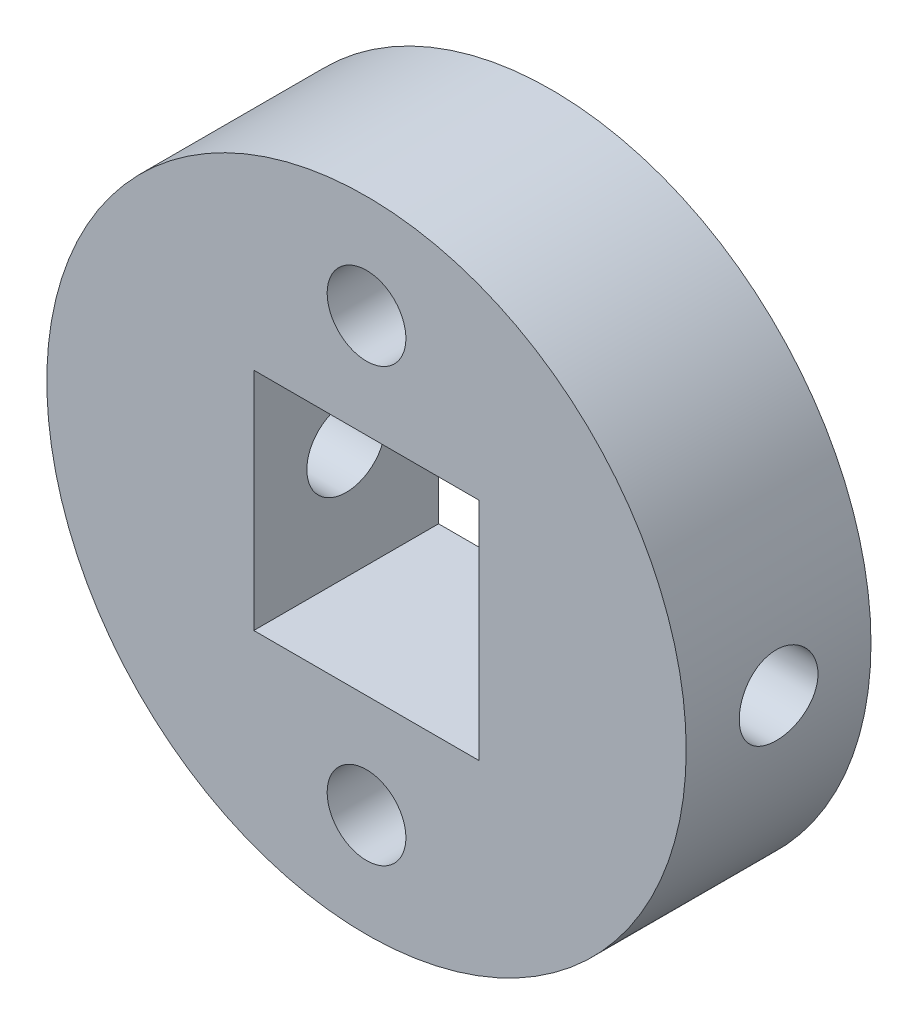
ISO-10303-21;
HEADER;
FILE_DESCRIPTION(('STEP AP214'),'2;1');
FILE_NAME('part.step','',(''),(''),'','','');
FILE_SCHEMA(('AUTOMOTIVE_DESIGN { 1 0 10303 214 1 1 1 1 }'));
ENDSEC;
DATA;
#1=APPLICATION_CONTEXT('core data for automotive mechanical design processes');
#2=APPLICATION_PROTOCOL_DEFINITION('international standard','automotive_design',2000,#1);
#3=PRODUCT_CONTEXT('',#1,'mechanical');
#4=PRODUCT('Part','Part','',(#3));
#5=PRODUCT_RELATED_PRODUCT_CATEGORY('part','',(#4));
#6=PRODUCT_DEFINITION_FORMATION('','',#4);
#7=PRODUCT_DEFINITION_CONTEXT('part definition',#1,'design');
#8=PRODUCT_DEFINITION('design','',#6,#7);
#9=PRODUCT_DEFINITION_SHAPE('','',#8);
#10=(LENGTH_UNIT() NAMED_UNIT(*) SI_UNIT(.MILLI.,.METRE.));
#11=(NAMED_UNIT(*) PLANE_ANGLE_UNIT() SI_UNIT($,.RADIAN.));
#12=(NAMED_UNIT(*) SI_UNIT($,.STERADIAN.) SOLID_ANGLE_UNIT());
#13=UNCERTAINTY_MEASURE_WITH_UNIT(LENGTH_MEASURE(1.E-05),#10,'distance_accuracy_value','');
#14=(GEOMETRIC_REPRESENTATION_CONTEXT(3) GLOBAL_UNCERTAINTY_ASSIGNED_CONTEXT((#13)) GLOBAL_UNIT_ASSIGNED_CONTEXT((#10,
#11,#12)) REPRESENTATION_CONTEXT('',''));
#15=CARTESIAN_POINT('',(0.,0.,0.));
#16=DIRECTION('',(0.,0.,1.));
#17=DIRECTION('',(1.,0.,0.));
#18=AXIS2_PLACEMENT_3D('',#15,#16,#17);
#19=CARTESIAN_POINT('',(0.,0.,6.35));
#20=DIRECTION('',(0.,0.,1.));
#21=DIRECTION('',(1.,0.,0.));
#22=AXIS2_PLACEMENT_3D('',#19,#20,#21);
#23=PLANE('',#22);
#24=CARTESIAN_POINT('',(0.,-7.4295,6.35));
#25=DIRECTION('',(0.,0.,-1.));
#26=DIRECTION('',(-1.,0.,0.));
#27=AXIS2_PLACEMENT_3D('',#24,#25,#26);
#28=CIRCLE('',#27,1.35255);
#29=CARTESIAN_POINT('',(-1.35255,-7.4295,6.35));
#30=VERTEX_POINT('',#29);
#31=EDGE_CURVE('E170',#30,#30,#28,.T.);
#32=ORIENTED_EDGE('',*,*,#31,.T.);
#33=EDGE_LOOP('',(#32));
#34=FACE_BOUND('',#33,.T.);
#35=CARTESIAN_POINT('',(0.,7.4295,6.35));
#36=DIRECTION('',(0.,0.,-1.));
#37=DIRECTION('',(-1.,0.,0.));
#38=AXIS2_PLACEMENT_3D('',#35,#36,#37);
#39=CIRCLE('',#38,1.35255);
#40=CARTESIAN_POINT('',(-1.35255,7.4295,6.35));
#41=VERTEX_POINT('',#40);
#42=EDGE_CURVE('E169',#41,#41,#39,.T.);
#43=ORIENTED_EDGE('',*,*,#42,.T.);
#44=EDGE_LOOP('',(#43));
#45=FACE_BOUND('',#44,.T.);
#46=CARTESIAN_POINT('',(0.,0.,6.35));
#47=DIRECTION('',(0.,0.,1.));
#48=DIRECTION('',(1.,0.,0.));
#49=AXIS2_PLACEMENT_3D('',#46,#47,#48);
#50=CIRCLE('',#49,10.9855);
#51=CARTESIAN_POINT('',(10.9855,0.,6.35));
#52=VERTEX_POINT('',#51);
#53=EDGE_CURVE('E118',#52,#52,#50,.T.);
#54=ORIENTED_EDGE('',*,*,#53,.T.);
#55=EDGE_LOOP('',(#54));
#56=FACE_BOUND('',#55,.T.);
#57=DIRECTION('',(-1.,0.,0.));
#58=VECTOR('',#57,1.);
#59=CARTESIAN_POINT('',(-3.8735,3.8735,6.35));
#60=LINE('',#59,#58);
#61=CARTESIAN_POINT('',(3.8735,3.8735,6.35));
#62=VERTEX_POINT('',#61);
#63=CARTESIAN_POINT('',(-3.8735,3.8735,6.35));
#64=VERTEX_POINT('',#63);
#65=EDGE_CURVE('E88',#62,#64,#60,.T.);
#66=ORIENTED_EDGE('',*,*,#65,.F.);
#67=DIRECTION('',(0.,1.,0.));
#68=VECTOR('',#67,1.);
#69=CARTESIAN_POINT('',(3.8735,-3.8735,6.35));
#70=LINE('',#69,#68);
#71=CARTESIAN_POINT('',(3.8735,-3.8735,6.35));
#72=VERTEX_POINT('',#71);
#73=EDGE_CURVE('E80',#72,#62,#70,.T.);
#74=ORIENTED_EDGE('',*,*,#73,.F.);
#75=DIRECTION('',(1.,0.,0.));
#76=VECTOR('',#75,1.);
#77=CARTESIAN_POINT('',(-3.8735,-3.8735,6.35));
#78=LINE('',#77,#76);
#79=CARTESIAN_POINT('',(-3.8735,-3.8735,6.35));
#80=VERTEX_POINT('',#79);
#81=EDGE_CURVE('E102',#80,#72,#78,.T.);
#82=ORIENTED_EDGE('',*,*,#81,.F.);
#83=DIRECTION('',(0.,-1.,0.));
#84=VECTOR('',#83,1.);
#85=CARTESIAN_POINT('',(-3.8735,-3.8735,6.35));
#86=LINE('',#85,#84);
#87=EDGE_CURVE('E100',#64,#80,#86,.T.);
#88=ORIENTED_EDGE('',*,*,#87,.F.);
#89=EDGE_LOOP('',(#66,#74,#82,#88));
#90=FACE_BOUND('',#89,.T.);
#91=ADVANCED_FACE('F35',(#34,#45,#56,#90),#23,.T.);
#92=CARTESIAN_POINT('',(0.,0.,0.));
#93=DIRECTION('',(0.,0.,1.));
#94=DIRECTION('',(1.,0.,0.));
#95=AXIS2_PLACEMENT_3D('',#92,#93,#94);
#96=PLANE('',#95);
#97=CARTESIAN_POINT('',(0.,-7.4295,0.));
#98=DIRECTION('',(0.,0.,-1.));
#99=DIRECTION('',(-1.,0.,0.));
#100=AXIS2_PLACEMENT_3D('',#97,#98,#99);
#101=CIRCLE('',#100,1.35255);
#102=CARTESIAN_POINT('',(-1.35255,-7.4295,0.));
#103=VERTEX_POINT('',#102);
#104=EDGE_CURVE('E158',#103,#103,#101,.T.);
#105=ORIENTED_EDGE('',*,*,#104,.F.);
#106=EDGE_LOOP('',(#105));
#107=FACE_BOUND('',#106,.T.);
#108=CARTESIAN_POINT('',(0.,7.4295,0.));
#109=DIRECTION('',(0.,0.,-1.));
#110=DIRECTION('',(-1.,0.,0.));
#111=AXIS2_PLACEMENT_3D('',#108,#109,#110);
#112=CIRCLE('',#111,1.35255);
#113=CARTESIAN_POINT('',(-1.35255,7.4295,0.));
#114=VERTEX_POINT('',#113);
#115=EDGE_CURVE('E162',#114,#114,#112,.T.);
#116=ORIENTED_EDGE('',*,*,#115,.F.);
#117=EDGE_LOOP('',(#116));
#118=FACE_BOUND('',#117,.T.);
#119=CARTESIAN_POINT('',(0.,0.,0.));
#120=DIRECTION('',(0.,0.,1.));
#121=DIRECTION('',(1.,0.,0.));
#122=AXIS2_PLACEMENT_3D('',#119,#120,#121);
#123=CIRCLE('',#122,10.9855);
#124=CARTESIAN_POINT('',(10.9855,0.,0.));
#125=VERTEX_POINT('',#124);
#126=EDGE_CURVE('E96',#125,#125,#123,.T.);
#127=ORIENTED_EDGE('',*,*,#126,.F.);
#128=EDGE_LOOP('',(#127));
#129=FACE_BOUND('',#128,.T.);
#130=DIRECTION('',(0.,1.,0.));
#131=VECTOR('',#130,1.);
#132=CARTESIAN_POINT('',(3.8735,-3.8735,0.));
#133=LINE('',#132,#131);
#134=CARTESIAN_POINT('',(3.8735,-3.8735,0.));
#135=VERTEX_POINT('',#134);
#136=CARTESIAN_POINT('',(3.8735,3.8735,0.));
#137=VERTEX_POINT('',#136);
#138=EDGE_CURVE('E62',#135,#137,#133,.T.);
#139=ORIENTED_EDGE('',*,*,#138,.T.);
#140=DIRECTION('',(-1.,0.,0.));
#141=VECTOR('',#140,1.);
#142=CARTESIAN_POINT('',(-3.8735,3.8735,0.));
#143=LINE('',#142,#141);
#144=CARTESIAN_POINT('',(-3.8735,3.8735,0.));
#145=VERTEX_POINT('',#144);
#146=EDGE_CURVE('E95',#137,#145,#143,.T.);
#147=ORIENTED_EDGE('',*,*,#146,.T.);
#148=DIRECTION('',(0.,-1.,0.));
#149=VECTOR('',#148,1.);
#150=CARTESIAN_POINT('',(-3.8735,-3.8735,0.));
#151=LINE('',#150,#149);
#152=CARTESIAN_POINT('',(-3.8735,-3.8735,0.));
#153=VERTEX_POINT('',#152);
#154=EDGE_CURVE('E110',#145,#153,#151,.T.);
#155=ORIENTED_EDGE('',*,*,#154,.T.);
#156=DIRECTION('',(1.,0.,0.));
#157=VECTOR('',#156,1.);
#158=CARTESIAN_POINT('',(-3.8735,-3.8735,0.));
#159=LINE('',#158,#157);
#160=EDGE_CURVE('E89',#153,#135,#159,.T.);
#161=ORIENTED_EDGE('',*,*,#160,.T.);
#162=EDGE_LOOP('',(#139,#147,#155,#161));
#163=FACE_BOUND('',#162,.T.);
#164=ADVANCED_FACE('F147',(#107,#118,#129,#163),#96,.F.);
#165=CARTESIAN_POINT('',(0.,0.,6.35));
#166=DIRECTION('',(0.,0.,-1.));
#167=DIRECTION('',(-1.,0.,0.));
#168=AXIS2_PLACEMENT_3D('',#165,#166,#167);
#169=CYLINDRICAL_SURFACE('',#168,10.9855);
#170=CARTESIAN_POINT('',(-10.9855,0.,1.82245000000001));
#171=CARTESIAN_POINT('',(-10.985498957363,0.0756662162892515,1.82245322021186));
#172=CARTESIAN_POINT('',(-10.984709975864,0.151379942554252,1.82882094142912));
#173=CARTESIAN_POINT('',(-10.9816384618443,0.300701184764233,1.85412287565918));
#174=CARTESIAN_POINT('',(-10.9793543627383,0.374306406888228,1.87307026996058));
#175=CARTESIAN_POINT('',(-10.9735499724927,0.517227243019656,1.92296540642161));
#176=CARTESIAN_POINT('',(-10.9700305065537,0.586545684246488,1.95390513937142));
#177=CARTESIAN_POINT('',(-10.9621469922232,0.71899296324033,2.02688932930371));
#178=CARTESIAN_POINT('',(-10.9577830906441,0.782122874066539,2.06893185643231));
#179=CARTESIAN_POINT('',(-10.9486719690168,0.900752004222969,2.16316864625308));
#180=CARTESIAN_POINT('',(-10.9439230188851,0.956213365972777,2.21541040312885));
#181=CARTESIAN_POINT('',(-10.9345910150808,1.05760506470752,2.32846077026844));
#182=CARTESIAN_POINT('',(-10.9300079698058,1.1035349197966,2.38926981341804));
#183=CARTESIAN_POINT('',(-10.9215096106737,1.18470031478497,2.51797394252124));
#184=CARTESIAN_POINT('',(-10.9175965239231,1.21990047795271,2.58589149801702));
#185=CARTESIAN_POINT('',(-10.9109038561484,1.27838136450854,2.72673014975643));
#186=CARTESIAN_POINT('',(-10.9081242333961,1.30166252669949,2.79965106168735));
#187=CARTESIAN_POINT('',(-10.9040296732988,1.33552971643817,2.94803404313264));
#188=CARTESIAN_POINT('',(-10.9027073727078,1.34617958568991,3.02348133458864));
#189=CARTESIAN_POINT('',(-10.9016546151378,1.35467941015745,3.17510303021034));
#190=CARTESIAN_POINT('',(-10.9019240959895,1.35252986527228,3.25127740586274));
#191=CARTESIAN_POINT('',(-10.904017715658,1.33554430280861,3.40174643573768));
#192=CARTESIAN_POINT('',(-10.905833242709,1.32077855829166,3.47604915951025));
#193=CARTESIAN_POINT('',(-10.9108009572682,1.27908936011294,3.62111402003232));
#194=CARTESIAN_POINT('',(-10.9139531711192,1.25216566684779,3.69187608697361));
#195=CARTESIAN_POINT('',(-10.9212488607713,1.18684913528334,3.82806957290694));
#196=CARTESIAN_POINT('',(-10.9253949745184,1.14842570650951,3.893486174053));
#197=CARTESIAN_POINT('',(-10.9342092467618,1.06122229554948,4.01696943795403));
#198=CARTESIAN_POINT('',(-10.9388774284228,1.01244185372596,4.07503577432654));
#199=CARTESIAN_POINT('',(-10.9482481397586,0.905519407597169,4.18257814431771));
#200=CARTESIAN_POINT('',(-10.9529506898525,0.847316821845073,4.2319939638781));
#201=CARTESIAN_POINT('',(-10.9618309693402,0.723410981534479,4.32036390388339));
#202=CARTESIAN_POINT('',(-10.9660086975844,0.657707710547477,4.35931800141369));
#203=CARTESIAN_POINT('',(-10.973371100294,0.520619528099018,4.4256585752767));
#204=CARTESIAN_POINT('',(-10.9765554560804,0.449232802556392,4.45304134046406));
#205=CARTESIAN_POINT('',(-10.9815694072985,0.302826693394582,4.49541445569743));
#206=CARTESIAN_POINT('',(-10.9833990642513,0.227807474903285,4.51040536850035));
#207=CARTESIAN_POINT('',(-10.9854894761024,0.076786607145977,4.52749133655337));
#208=CARTESIAN_POINT('',(-10.9857603235799,0.000794477815036689,4.52966935150521));
#209=CARTESIAN_POINT('',(-10.98472983342,-0.150471667753615,4.52128654388073));
#210=CARTESIAN_POINT('',(-10.983428528243,-0.225745698785651,4.51072598431938));
#211=CARTESIAN_POINT('',(-10.9794062526405,-0.37319454870657,4.47723471389979));
#212=CARTESIAN_POINT('',(-10.9766898160552,-0.445378473165177,4.45434350044147));
#213=CARTESIAN_POINT('',(-10.9701414522363,-0.584882795940893,4.39688174479581));
#214=CARTESIAN_POINT('',(-10.9663094881588,-0.652203033527449,4.36231081684235));
#215=CARTESIAN_POINT('',(-10.9579322413848,-0.780439889706667,4.28226984364084));
#216=CARTESIAN_POINT('',(-10.9533834813827,-0.841322738919962,4.23674606527089));
#217=CARTESIAN_POINT('',(-10.9440925211964,-0.954613150762994,4.13616774658086));
#218=CARTESIAN_POINT('',(-10.9393503135765,-1.00702038722132,4.08111283963814));
#219=CARTESIAN_POINT('',(-10.9301758586455,-1.10216574586961,3.96266991982286));
#220=CARTESIAN_POINT('',(-10.9257454660101,-1.1448489203689,3.89923760285575));
#221=CARTESIAN_POINT('',(-10.9177265933334,-1.21895508987927,3.76605575269222));
#222=CARTESIAN_POINT('',(-10.9141380968412,-1.25037830491825,3.69630634296981));
#223=CARTESIAN_POINT('',(-10.9082218729706,-1.30098335677853,3.55264845034915));
#224=CARTESIAN_POINT('',(-10.9058909426587,-1.32019631472361,3.47875106772464));
#225=CARTESIAN_POINT('',(-10.9027445215885,-1.3459357523905,3.3287484522286));
#226=CARTESIAN_POINT('',(-10.9019289626019,-1.35246280328493,3.25264331891585));
#227=CARTESIAN_POINT('',(-10.9019075696062,-1.35263488131563,3.10093215651525));
#228=CARTESIAN_POINT('',(-10.9026909487184,-1.34636623176684,3.02532621231655));
#229=CARTESIAN_POINT('',(-10.9057559894638,-1.32130750279951,2.87625115678073));
#230=CARTESIAN_POINT('',(-10.908037651404,-1.30251742081543,2.80278204588143));
#231=CARTESIAN_POINT('',(-10.9138388641635,-1.25297594495023,2.66007666440372));
#232=CARTESIAN_POINT('',(-10.9173579981753,-1.22222857817304,2.59083897779543));
#233=CARTESIAN_POINT('',(-10.9252383394411,-1.14965384729889,2.45849205211765));
#234=CARTESIAN_POINT('',(-10.9295995560004,-1.10782636076196,2.39538288078137));
#235=CARTESIAN_POINT('',(-10.9387079192267,-1.01395807244356,2.27664302261158));
#236=CARTESIAN_POINT('',(-10.94345738093,-0.961852922869473,2.22106337931411));
#237=CARTESIAN_POINT('',(-10.9527865819289,-0.849042246881335,2.11940316882315));
#238=CARTESIAN_POINT('',(-10.9573662808957,-0.788334693191169,2.07332484705058));
#239=CARTESIAN_POINT('',(-10.9658585550583,-0.659786097634867,1.99183111491038));
#240=CARTESIAN_POINT('',(-10.9697686043229,-0.591919541801462,1.95645570771185));
#241=CARTESIAN_POINT('',(-10.9764553067321,-0.451199383169794,1.89765388229206));
#242=CARTESIAN_POINT('',(-10.9792331945981,-0.378351314986264,1.8742144398554));
#243=CARTESIAN_POINT('',(-10.9826705918215,-0.254269465037126,1.84557997558929));
#244=CARTESIAN_POINT('',(-10.9837264691404,-0.20381908395256,1.83691864942233));
#245=CARTESIAN_POINT('',(-10.9851415230865,-0.102253032067665,1.82535259383982));
#246=CARTESIAN_POINT('',(-10.9855007046435,-0.0511373659775836,1.82244782368989));
#247=CARTESIAN_POINT('',(-10.9855,0.,1.82245000000001));
#248=B_SPLINE_CURVE_WITH_KNOTS('',3,(#170,#171,#172,#173,#174,#175,#176,#177,#178,#179,#180,
#181,#182,#183,#184,#185,#186,#187,#188,#189,#190,#191,#192,#193,#194,#195,#196,#197,#198,#199,
#200,#201,#202,#203,#204,#205,#206,#207,#208,#209,#210,#211,#212,#213,#214,#215,#216,#217,#218,
#219,#220,#221,#222,#223,#224,#225,#226,#227,#228,#229,#230,#231,#232,#233,#234,#235,#236,#237,
#238,#239,#240,#241,#242,#243,#244,#245,#246,#247),.UNSPECIFIED.,.T.,.F.,(4,2,2,2,2,2,2,2,2,2,2,
2,2,2,2,2,2,2,2,2,2,2,2,2,2,2,2,2,2,2,2,2,2,2,2,2,2,2,4),(0.,0.226811864735638,
0.453861764353082,0.680760286857207,0.907619396479579,1.13556125211483,1.36351462927464,
1.59221165570891,1.82090026196349,2.0484280254365,2.27594690255271,2.50220668498508,
2.72847092663824,2.95534248636422,3.18222411660358,3.41062712350764,3.63903063068491,
3.86750733569655,4.0959736642199,4.32295909889393,4.54993984705094,4.77619781958037,
5.00246326585366,5.22986222220812,5.45726992759339,5.68593242000035,5.91459044393052,
6.14266330905155,6.37072590514026,6.59725501387006,6.82378416901388,7.05023709719496,
7.27669252788045,7.50461356020783,7.73258839490117,7.96140507041502,8.18997152919245,
8.343258477822,8.496544341763),.UNSPECIFIED.);
#249=CARTESIAN_POINT('',(-10.9855,0.,1.82245000000001));
#250=VERTEX_POINT('',#249);
#251=EDGE_CURVE('E11',#250,#250,#248,.T.);
#252=ORIENTED_EDGE('',*,*,#251,.T.);
#253=EDGE_LOOP('',(#252));
#254=FACE_BOUND('',#253,.T.);
#255=CARTESIAN_POINT('',(10.9855,0.,4.52754999999999));
#256=CARTESIAN_POINT('',(10.985498957363,0.0756662162892515,4.52754677978814));
#257=CARTESIAN_POINT('',(10.984709975864,0.151379942554252,4.52117905857088));
#258=CARTESIAN_POINT('',(10.9816384618443,0.300701184764233,4.49587712434082));
#259=CARTESIAN_POINT('',(10.9793543627383,0.374306406888228,4.47692973003942));
#260=CARTESIAN_POINT('',(10.9735499724927,0.517227243019656,4.42703459357839));
#261=CARTESIAN_POINT('',(10.9700305065537,0.586545684246487,4.39609486062858));
#262=CARTESIAN_POINT('',(10.9621469922232,0.71899296324033,4.3231106706963));
#263=CARTESIAN_POINT('',(10.9577830906441,0.782122874066539,4.28106814356769));
#264=CARTESIAN_POINT('',(10.9486719690168,0.900752004222968,4.18683135374692));
#265=CARTESIAN_POINT('',(10.9439230188851,0.956213365972777,4.13458959687115));
#266=CARTESIAN_POINT('',(10.9345910150808,1.05760506470752,4.02153922973156));
#267=CARTESIAN_POINT('',(10.9300079698058,1.1035349197966,3.96073018658196));
#268=CARTESIAN_POINT('',(10.9215096106737,1.18470031478497,3.83202605747876));
#269=CARTESIAN_POINT('',(10.9175965239231,1.21990047795271,3.76410850198298));
#270=CARTESIAN_POINT('',(10.9109038561484,1.27838136450854,3.62326985024357));
#271=CARTESIAN_POINT('',(10.9081242333961,1.30166252669949,3.55034893831265));
#272=CARTESIAN_POINT('',(10.9040296732988,1.33552971643817,3.40196595686736));
#273=CARTESIAN_POINT('',(10.9027073727078,1.34617958568991,3.32651866541137));
#274=CARTESIAN_POINT('',(10.9016546151378,1.35467941015745,3.17489696978967));
#275=CARTESIAN_POINT('',(10.9019240959895,1.35252986527228,3.09872259413726));
#276=CARTESIAN_POINT('',(10.904017715658,1.33554430280861,2.94825356426232));
#277=CARTESIAN_POINT('',(10.905833242709,1.32077855829166,2.87395084048975));
#278=CARTESIAN_POINT('',(10.9108009572682,1.27908936011294,2.72888597996768));
#279=CARTESIAN_POINT('',(10.9139531711192,1.25216566684779,2.65812391302639));
#280=CARTESIAN_POINT('',(10.9212488607713,1.18684913528334,2.52193042709307));
#281=CARTESIAN_POINT('',(10.9253949745184,1.14842570650951,2.456513825947));
#282=CARTESIAN_POINT('',(10.9342092467618,1.06122229554948,2.33303056204598));
#283=CARTESIAN_POINT('',(10.9388774284228,1.01244185372596,2.27496422567346));
#284=CARTESIAN_POINT('',(10.9482481397586,0.905519407597169,2.16742185568229));
#285=CARTESIAN_POINT('',(10.9529506898525,0.847316821845073,2.1180060361219));
#286=CARTESIAN_POINT('',(10.9618309693402,0.723410981534479,2.02963609611661));
#287=CARTESIAN_POINT('',(10.9660086975844,0.657707710547477,1.99068199858631));
#288=CARTESIAN_POINT('',(10.973371100294,0.520619528099018,1.9243414247233));
#289=CARTESIAN_POINT('',(10.9765554560804,0.449232802556392,1.89695865953594));
#290=CARTESIAN_POINT('',(10.9815694072985,0.302826693394583,1.85458554430258));
#291=CARTESIAN_POINT('',(10.9833990642513,0.227807474903286,1.83959463149966));
#292=CARTESIAN_POINT('',(10.9854894761024,0.0767866071459776,1.82250866344663));
#293=CARTESIAN_POINT('',(10.9857603235799,0.000794477815037326,1.82033064849479));
#294=CARTESIAN_POINT('',(10.98472983342,-0.150471667753615,1.82871345611927));
#295=CARTESIAN_POINT('',(10.983428528243,-0.225745698785651,1.83927401568062));
#296=CARTESIAN_POINT('',(10.9794062526405,-0.37319454870657,1.87276528610021));
#297=CARTESIAN_POINT('',(10.9766898160552,-0.445378473165177,1.89565649955853));
#298=CARTESIAN_POINT('',(10.9701414522363,-0.584882795940893,1.95311825520419));
#299=CARTESIAN_POINT('',(10.9663094881588,-0.652203033527449,1.98768918315765));
#300=CARTESIAN_POINT('',(10.9579322413848,-0.780439889706667,2.06773015635916));
#301=CARTESIAN_POINT('',(10.9533834813827,-0.841322738919962,2.11325393472911));
#302=CARTESIAN_POINT('',(10.9440925211964,-0.954613150762994,2.21383225341914));
#303=CARTESIAN_POINT('',(10.9393503135765,-1.00702038722132,2.26888716036186));
#304=CARTESIAN_POINT('',(10.9301758586455,-1.10216574586961,2.38733008017714));
#305=CARTESIAN_POINT('',(10.9257454660101,-1.14484892036889,2.45076239714426));
#306=CARTESIAN_POINT('',(10.9177265933334,-1.21895508987927,2.58394424730778));
#307=CARTESIAN_POINT('',(10.9141380968412,-1.25037830491825,2.65369365703019));
#308=CARTESIAN_POINT('',(10.9082218729706,-1.30098335677853,2.79735154965085));
#309=CARTESIAN_POINT('',(10.9058909426587,-1.32019631472361,2.87124893227536));
#310=CARTESIAN_POINT('',(10.9027445215885,-1.3459357523905,3.0212515477714));
#311=CARTESIAN_POINT('',(10.9019289626019,-1.35246280328493,3.09735668108415));
#312=CARTESIAN_POINT('',(10.9019075696062,-1.35263488131563,3.24906784348475));
#313=CARTESIAN_POINT('',(10.9026909487184,-1.34636623176684,3.32467378768345));
#314=CARTESIAN_POINT('',(10.9057559894638,-1.32130750279951,3.47374884321927));
#315=CARTESIAN_POINT('',(10.908037651404,-1.30251742081543,3.54721795411858));
#316=CARTESIAN_POINT('',(10.9138388641635,-1.25297594495023,3.68992333559628));
#317=CARTESIAN_POINT('',(10.9173579981753,-1.22222857817304,3.75916102220457));
#318=CARTESIAN_POINT('',(10.9252383394411,-1.14965384729889,3.89150794788235));
#319=CARTESIAN_POINT('',(10.9295995560004,-1.10782636076196,3.95461711921863));
#320=CARTESIAN_POINT('',(10.9387079192267,-1.01395807244356,4.07335697738842));
#321=CARTESIAN_POINT('',(10.94345738093,-0.961852922869475,4.12893662068589));
#322=CARTESIAN_POINT('',(10.9527865819289,-0.849042246881336,4.23059683117685));
#323=CARTESIAN_POINT('',(10.9573662808957,-0.78833469319117,4.27667515294942));
#324=CARTESIAN_POINT('',(10.9658585550583,-0.659786097634868,4.35816888508962));
#325=CARTESIAN_POINT('',(10.9697686043229,-0.591919541801463,4.39354429228815));
#326=CARTESIAN_POINT('',(10.9764553067321,-0.451199383169796,4.45234611770794));
#327=CARTESIAN_POINT('',(10.9792331945981,-0.378351314986264,4.4757855601446));
#328=CARTESIAN_POINT('',(10.9826705918215,-0.254269465037126,4.50442002441071));
#329=CARTESIAN_POINT('',(10.9837264691404,-0.20381908395256,4.51308135057767));
#330=CARTESIAN_POINT('',(10.9851415230865,-0.102253032067665,4.52464740616018));
#331=CARTESIAN_POINT('',(10.9855007046435,-0.0511373659775832,4.52755217631011));
#332=CARTESIAN_POINT('',(10.9855,0.,4.52754999999999));
#333=B_SPLINE_CURVE_WITH_KNOTS('',3,(#255,#256,#257,#258,#259,#260,#261,#262,#263,#264,#265,
#266,#267,#268,#269,#270,#271,#272,#273,#274,#275,#276,#277,#278,#279,#280,#281,#282,#283,#284,
#285,#286,#287,#288,#289,#290,#291,#292,#293,#294,#295,#296,#297,#298,#299,#300,#301,#302,#303,
#304,#305,#306,#307,#308,#309,#310,#311,#312,#313,#314,#315,#316,#317,#318,#319,#320,#321,#322,
#323,#324,#325,#326,#327,#328,#329,#330,#331,#332),.UNSPECIFIED.,.T.,.F.,(4,2,2,2,2,2,2,2,2,2,2,
2,2,2,2,2,2,2,2,2,2,2,2,2,2,2,2,2,2,2,2,2,2,2,2,2,2,2,4),(0.,0.226811864735638,
0.453861764353082,0.680760286857207,0.907619396479578,1.13556125211483,1.36351462927464,
1.59221165570891,1.82090026196349,2.0484280254365,2.27594690255271,2.50220668498508,
2.72847092663824,2.95534248636422,3.18222411660358,3.41062712350764,3.63903063068491,
3.86750733569655,4.0959736642199,4.32295909889393,4.54993984705094,4.77619781958037,
5.00246326585366,5.22986222220811,5.45726992759339,5.68593242000035,5.91459044393052,
6.14266330905155,6.37072590514025,6.59725501387005,6.82378416901388,7.05023709719496,
7.27669252788044,7.50461356020782,7.73258839490117,7.96140507041502,8.18997152919245,
8.343258477822,8.49654434176299),.UNSPECIFIED.);
#334=CARTESIAN_POINT('',(10.9855,0.,4.52754999999999));
#335=VERTEX_POINT('',#334);
#336=EDGE_CURVE('E47',#335,#335,#333,.T.);
#337=ORIENTED_EDGE('',*,*,#336,.T.);
#338=EDGE_LOOP('',(#337));
#339=FACE_BOUND('',#338,.T.);
#340=ORIENTED_EDGE('',*,*,#53,.F.);
#341=EDGE_LOOP('',(#340));
#342=FACE_BOUND('',#341,.T.);
#343=ORIENTED_EDGE('',*,*,#126,.T.);
#344=EDGE_LOOP('',(#343));
#345=FACE_BOUND('',#344,.T.);
#346=ADVANCED_FACE('F37',(#254,#339,#342,#345),#169,.T.);
#347=CARTESIAN_POINT('',(3.8735,-3.8735,6.35));
#348=DIRECTION('',(-1.,0.,0.));
#349=DIRECTION('',(0.,0.,1.));
#350=AXIS2_PLACEMENT_3D('',#347,#348,#349);
#351=PLANE('',#350);
#352=CARTESIAN_POINT('',(3.8735,0.,3.175));
#353=DIRECTION('',(-1.,0.,0.));
#354=DIRECTION('',(0.,0.,1.));
#355=AXIS2_PLACEMENT_3D('',#352,#353,#354);
#356=CIRCLE('',#355,1.35254999999999);
#357=CARTESIAN_POINT('',(3.8735,0.,4.52754999999999));
#358=VERTEX_POINT('',#357);
#359=EDGE_CURVE('E108',#358,#358,#356,.T.);
#360=ORIENTED_EDGE('',*,*,#359,.F.);
#361=EDGE_LOOP('',(#360));
#362=FACE_BOUND('',#361,.T.);
#363=ORIENTED_EDGE('',*,*,#138,.F.);
#364=DIRECTION('',(0.,0.,-1.));
#365=VECTOR('',#364,1.);
#366=CARTESIAN_POINT('',(3.8735,-3.8735,6.35));
#367=LINE('',#366,#365);
#368=EDGE_CURVE('E84',#72,#135,#367,.T.);
#369=ORIENTED_EDGE('',*,*,#368,.F.);
#370=ORIENTED_EDGE('',*,*,#73,.T.);
#371=DIRECTION('',(0.,0.,-1.));
#372=VECTOR('',#371,1.);
#373=CARTESIAN_POINT('',(3.8735,3.8735,6.35));
#374=LINE('',#373,#372);
#375=EDGE_CURVE('E83',#62,#137,#374,.T.);
#376=ORIENTED_EDGE('',*,*,#375,.T.);
#377=EDGE_LOOP('',(#363,#369,#370,#376));
#378=FACE_BOUND('',#377,.T.);
#379=ADVANCED_FACE('F82',(#362,#378),#351,.T.);
#380=CARTESIAN_POINT('',(-3.8735,3.8735,6.35));
#381=DIRECTION('',(0.,-1.,0.));
#382=DIRECTION('',(0.,0.,-1.));
#383=AXIS2_PLACEMENT_3D('',#380,#381,#382);
#384=PLANE('',#383);
#385=ORIENTED_EDGE('',*,*,#146,.F.);
#386=ORIENTED_EDGE('',*,*,#375,.F.);
#387=ORIENTED_EDGE('',*,*,#65,.T.);
#388=DIRECTION('',(0.,0.,-1.));
#389=VECTOR('',#388,1.);
#390=CARTESIAN_POINT('',(-3.8735,3.8735,6.35));
#391=LINE('',#390,#389);
#392=EDGE_CURVE('E97',#64,#145,#391,.T.);
#393=ORIENTED_EDGE('',*,*,#392,.T.);
#394=EDGE_LOOP('',(#385,#386,#387,#393));
#395=FACE_BOUND('',#394,.T.);
#396=ADVANCED_FACE('F92',(#395),#384,.T.);
#397=CARTESIAN_POINT('',(-3.8735,-3.8735,6.35));
#398=DIRECTION('',(1.,0.,0.));
#399=DIRECTION('',(0.,0.,-1.));
#400=AXIS2_PLACEMENT_3D('',#397,#398,#399);
#401=PLANE('',#400);
#402=CARTESIAN_POINT('',(-3.8735,0.,3.175));
#403=DIRECTION('',(1.,0.,0.));
#404=DIRECTION('',(0.,0.,-1.));
#405=AXIS2_PLACEMENT_3D('',#402,#403,#404);
#406=CIRCLE('',#405,1.35254999999999);
#407=CARTESIAN_POINT('',(-3.8735,0.,1.82245000000001));
#408=VERTEX_POINT('',#407);
#409=EDGE_CURVE('E173',#408,#408,#406,.T.);
#410=ORIENTED_EDGE('',*,*,#409,.F.);
#411=EDGE_LOOP('',(#410));
#412=FACE_BOUND('',#411,.T.);
#413=ORIENTED_EDGE('',*,*,#154,.F.);
#414=ORIENTED_EDGE('',*,*,#392,.F.);
#415=ORIENTED_EDGE('',*,*,#87,.T.);
#416=DIRECTION('',(0.,0.,-1.));
#417=VECTOR('',#416,1.);
#418=CARTESIAN_POINT('',(-3.8735,-3.8735,6.35));
#419=LINE('',#418,#417);
#420=EDGE_CURVE('E54',#80,#153,#419,.T.);
#421=ORIENTED_EDGE('',*,*,#420,.T.);
#422=EDGE_LOOP('',(#413,#414,#415,#421));
#423=FACE_BOUND('',#422,.T.);
#424=ADVANCED_FACE('F137',(#412,#423),#401,.T.);
#425=CARTESIAN_POINT('',(-3.8735,-3.8735,6.35));
#426=DIRECTION('',(0.,1.,0.));
#427=DIRECTION('',(0.,0.,1.));
#428=AXIS2_PLACEMENT_3D('',#425,#426,#427);
#429=PLANE('',#428);
#430=ORIENTED_EDGE('',*,*,#160,.F.);
#431=ORIENTED_EDGE('',*,*,#420,.F.);
#432=ORIENTED_EDGE('',*,*,#81,.T.);
#433=ORIENTED_EDGE('',*,*,#368,.T.);
#434=EDGE_LOOP('',(#430,#431,#432,#433));
#435=FACE_BOUND('',#434,.T.);
#436=ADVANCED_FACE('F131',(#435),#429,.T.);
#437=CARTESIAN_POINT('',(3.8735,0.,3.175));
#438=DIRECTION('',(-1.,0.,0.));
#439=DIRECTION('',(0.,0.,1.));
#440=AXIS2_PLACEMENT_3D('',#437,#438,#439);
#441=CYLINDRICAL_SURFACE('',#440,1.35254999999999);
#442=ORIENTED_EDGE('',*,*,#359,.T.);
#443=EDGE_LOOP('',(#442));
#444=FACE_BOUND('',#443,.T.);
#445=ORIENTED_EDGE('',*,*,#336,.F.);
#446=EDGE_LOOP('',(#445));
#447=FACE_BOUND('',#446,.T.);
#448=ADVANCED_FACE('F126',(#444,#447),#441,.F.);
#449=CARTESIAN_POINT('',(-3.8735,0.,3.175));
#450=DIRECTION('',(1.,0.,0.));
#451=DIRECTION('',(0.,0.,-1.));
#452=AXIS2_PLACEMENT_3D('',#449,#450,#451);
#453=CYLINDRICAL_SURFACE('',#452,1.35254999999999);
#454=ORIENTED_EDGE('',*,*,#409,.T.);
#455=EDGE_LOOP('',(#454));
#456=FACE_BOUND('',#455,.T.);
#457=ORIENTED_EDGE('',*,*,#251,.F.);
#458=EDGE_LOOP('',(#457));
#459=FACE_BOUND('',#458,.T.);
#460=ADVANCED_FACE('F130',(#456,#459),#453,.F.);
#461=CARTESIAN_POINT('',(0.,7.4295,0.));
#462=DIRECTION('',(0.,0.,-1.));
#463=DIRECTION('',(-1.,0.,0.));
#464=AXIS2_PLACEMENT_3D('',#461,#462,#463);
#465=CYLINDRICAL_SURFACE('',#464,1.35255);
#466=ORIENTED_EDGE('',*,*,#42,.F.);
#467=EDGE_LOOP('',(#466));
#468=FACE_BOUND('',#467,.T.);
#469=ORIENTED_EDGE('',*,*,#115,.T.);
#470=EDGE_LOOP('',(#469));
#471=FACE_BOUND('',#470,.T.);
#472=ADVANCED_FACE('F192',(#468,#471),#465,.F.);
#473=CARTESIAN_POINT('',(0.,-7.4295,0.));
#474=DIRECTION('',(0.,0.,-1.));
#475=DIRECTION('',(-1.,0.,0.));
#476=AXIS2_PLACEMENT_3D('',#473,#474,#475);
#477=CYLINDRICAL_SURFACE('',#476,1.35255);
#478=ORIENTED_EDGE('',*,*,#31,.F.);
#479=EDGE_LOOP('',(#478));
#480=FACE_BOUND('',#479,.T.);
#481=ORIENTED_EDGE('',*,*,#104,.T.);
#482=EDGE_LOOP('',(#481));
#483=FACE_BOUND('',#482,.T.);
#484=ADVANCED_FACE('F197',(#480,#483),#477,.F.);
#485=CLOSED_SHELL('',(#91,#164,#346,#379,#396,#424,#436,#448,#460,#472,#484));
#486=MANIFOLD_SOLID_BREP('B2',#485);
#487=ADVANCED_BREP_SHAPE_REPRESENTATION('',(#18,#486),#14);
#488=SHAPE_DEFINITION_REPRESENTATION(#9,#487);
ENDSEC;
END-ISO-10303-21;
